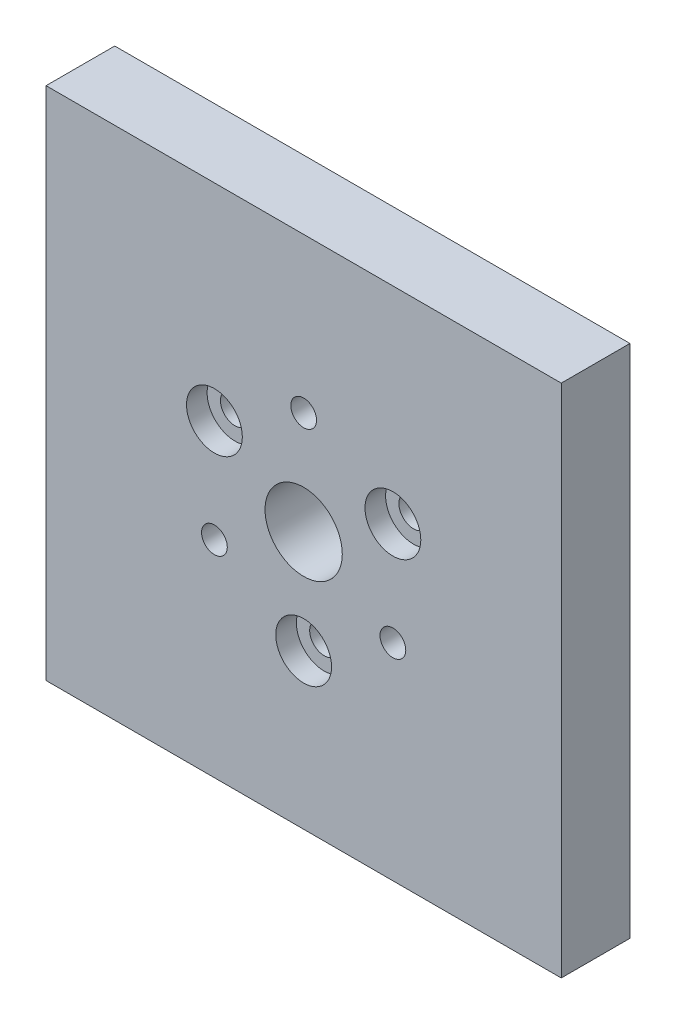
ISO-10303-21;
HEADER;
FILE_DESCRIPTION(('STEP AP214'),'2;1');
FILE_NAME('part.step','',(''),(''),'','','');
FILE_SCHEMA(('AUTOMOTIVE_DESIGN { 1 0 10303 214 1 1 1 1 }'));
ENDSEC;
DATA;
#1=APPLICATION_CONTEXT('core data for automotive mechanical design processes');
#2=APPLICATION_PROTOCOL_DEFINITION('international standard','automotive_design',2000,#1);
#3=PRODUCT_CONTEXT('',#1,'mechanical');
#4=PRODUCT('Part','Part','',(#3));
#5=PRODUCT_RELATED_PRODUCT_CATEGORY('part','',(#4));
#6=PRODUCT_DEFINITION_FORMATION('','',#4);
#7=PRODUCT_DEFINITION_CONTEXT('part definition',#1,'design');
#8=PRODUCT_DEFINITION('design','',#6,#7);
#9=PRODUCT_DEFINITION_SHAPE('','',#8);
#10=(LENGTH_UNIT() NAMED_UNIT(*) SI_UNIT(.MILLI.,.METRE.));
#11=(NAMED_UNIT(*) PLANE_ANGLE_UNIT() SI_UNIT($,.RADIAN.));
#12=(NAMED_UNIT(*) SI_UNIT($,.STERADIAN.) SOLID_ANGLE_UNIT());
#13=UNCERTAINTY_MEASURE_WITH_UNIT(LENGTH_MEASURE(1.E-05),#10,'distance_accuracy_value','');
#14=(GEOMETRIC_REPRESENTATION_CONTEXT(3) GLOBAL_UNCERTAINTY_ASSIGNED_CONTEXT((#13)) GLOBAL_UNIT_ASSIGNED_CONTEXT((#10,
#11,#12)) REPRESENTATION_CONTEXT('',''));
#15=CARTESIAN_POINT('',(0.,0.,0.));
#16=DIRECTION('',(0.,0.,1.));
#17=DIRECTION('',(1.,0.,0.));
#18=AXIS2_PLACEMENT_3D('',#15,#16,#17);
#19=CARTESIAN_POINT('',(0.,0.,8.));
#20=DIRECTION('',(1.,0.,0.));
#21=DIRECTION('',(0.,0.,-1.));
#22=AXIS2_PLACEMENT_3D('',#19,#20,#21);
#23=PLANE('',#22);
#24=DIRECTION('',(0.,-1.,0.));
#25=VECTOR('',#24,1.);
#26=CARTESIAN_POINT('',(0.,0.,0.));
#27=LINE('',#26,#25);
#28=CARTESIAN_POINT('',(0.,60.,0.));
#29=VERTEX_POINT('',#28);
#30=CARTESIAN_POINT('',(0.,0.,0.));
#31=VERTEX_POINT('',#30);
#32=EDGE_CURVE('E113',#29,#31,#27,.T.);
#33=ORIENTED_EDGE('',*,*,#32,.T.);
#34=DIRECTION('',(0.,0.,-1.));
#35=VECTOR('',#34,1.);
#36=CARTESIAN_POINT('',(0.,0.,8.));
#37=LINE('',#36,#35);
#38=CARTESIAN_POINT('',(0.,0.,8.));
#39=VERTEX_POINT('',#38);
#40=EDGE_CURVE('E11',#39,#31,#37,.T.);
#41=ORIENTED_EDGE('',*,*,#40,.F.);
#42=DIRECTION('',(0.,-1.,0.));
#43=VECTOR('',#42,1.);
#44=CARTESIAN_POINT('',(0.,0.,8.));
#45=LINE('',#44,#43);
#46=CARTESIAN_POINT('',(0.,60.,8.));
#47=VERTEX_POINT('',#46);
#48=EDGE_CURVE('E97',#47,#39,#45,.T.);
#49=ORIENTED_EDGE('',*,*,#48,.F.);
#50=DIRECTION('',(0.,0.,-1.));
#51=VECTOR('',#50,1.);
#52=CARTESIAN_POINT('',(0.,60.,8.));
#53=LINE('',#52,#51);
#54=EDGE_CURVE('E109',#47,#29,#53,.T.);
#55=ORIENTED_EDGE('',*,*,#54,.T.);
#56=EDGE_LOOP('',(#33,#41,#49,#55));
#57=FACE_BOUND('',#56,.T.);
#58=ADVANCED_FACE('F45',(#57),#23,.F.);
#59=CARTESIAN_POINT('',(0.,0.,8.));
#60=DIRECTION('',(0.,1.,0.));
#61=DIRECTION('',(0.,0.,1.));
#62=AXIS2_PLACEMENT_3D('',#59,#60,#61);
#63=PLANE('',#62);
#64=DIRECTION('',(1.,0.,0.));
#65=VECTOR('',#64,1.);
#66=CARTESIAN_POINT('',(0.,0.,0.));
#67=LINE('',#66,#65);
#68=CARTESIAN_POINT('',(60.,0.,0.));
#69=VERTEX_POINT('',#68);
#70=EDGE_CURVE('E102',#31,#69,#67,.T.);
#71=ORIENTED_EDGE('',*,*,#70,.T.);
#72=DIRECTION('',(0.,0.,-1.));
#73=VECTOR('',#72,1.);
#74=CARTESIAN_POINT('',(60.,0.,8.));
#75=LINE('',#74,#73);
#76=CARTESIAN_POINT('',(60.,0.,8.));
#77=VERTEX_POINT('',#76);
#78=EDGE_CURVE('E54',#77,#69,#75,.T.);
#79=ORIENTED_EDGE('',*,*,#78,.F.);
#80=DIRECTION('',(1.,0.,0.));
#81=VECTOR('',#80,1.);
#82=CARTESIAN_POINT('',(0.,0.,8.));
#83=LINE('',#82,#81);
#84=EDGE_CURVE('E92',#39,#77,#83,.T.);
#85=ORIENTED_EDGE('',*,*,#84,.F.);
#86=ORIENTED_EDGE('',*,*,#40,.T.);
#87=EDGE_LOOP('',(#71,#79,#85,#86));
#88=FACE_BOUND('',#87,.T.);
#89=ADVANCED_FACE('F101',(#88),#63,.F.);
#90=CARTESIAN_POINT('',(60.,0.,8.));
#91=DIRECTION('',(-1.,0.,0.));
#92=DIRECTION('',(0.,0.,1.));
#93=AXIS2_PLACEMENT_3D('',#90,#91,#92);
#94=PLANE('',#93);
#95=DIRECTION('',(0.,1.,0.));
#96=VECTOR('',#95,1.);
#97=CARTESIAN_POINT('',(60.,0.,0.));
#98=LINE('',#97,#96);
#99=CARTESIAN_POINT('',(60.,60.,0.));
#100=VERTEX_POINT('',#99);
#101=EDGE_CURVE('E79',#69,#100,#98,.T.);
#102=ORIENTED_EDGE('',*,*,#101,.T.);
#103=DIRECTION('',(0.,0.,-1.));
#104=VECTOR('',#103,1.);
#105=CARTESIAN_POINT('',(60.,60.,8.));
#106=LINE('',#105,#104);
#107=CARTESIAN_POINT('',(60.,60.,8.));
#108=VERTEX_POINT('',#107);
#109=EDGE_CURVE('E104',#108,#100,#106,.T.);
#110=ORIENTED_EDGE('',*,*,#109,.F.);
#111=DIRECTION('',(0.,1.,0.));
#112=VECTOR('',#111,1.);
#113=CARTESIAN_POINT('',(60.,0.,8.));
#114=LINE('',#113,#112);
#115=EDGE_CURVE('E95',#77,#108,#114,.T.);
#116=ORIENTED_EDGE('',*,*,#115,.F.);
#117=ORIENTED_EDGE('',*,*,#78,.T.);
#118=EDGE_LOOP('',(#102,#110,#116,#117));
#119=FACE_BOUND('',#118,.T.);
#120=ADVANCED_FACE('F105',(#119),#94,.F.);
#121=CARTESIAN_POINT('',(0.,60.,8.));
#122=DIRECTION('',(0.,-1.,0.));
#123=DIRECTION('',(0.,0.,-1.));
#124=AXIS2_PLACEMENT_3D('',#121,#122,#123);
#125=PLANE('',#124);
#126=DIRECTION('',(-1.,0.,0.));
#127=VECTOR('',#126,1.);
#128=CARTESIAN_POINT('',(0.,60.,0.));
#129=LINE('',#128,#127);
#130=EDGE_CURVE('E85',#100,#29,#129,.T.);
#131=ORIENTED_EDGE('',*,*,#130,.T.);
#132=ORIENTED_EDGE('',*,*,#54,.F.);
#133=DIRECTION('',(-1.,0.,0.));
#134=VECTOR('',#133,1.);
#135=CARTESIAN_POINT('',(0.,60.,8.));
#136=LINE('',#135,#134);
#137=EDGE_CURVE('E62',#108,#47,#136,.T.);
#138=ORIENTED_EDGE('',*,*,#137,.F.);
#139=ORIENTED_EDGE('',*,*,#109,.T.);
#140=EDGE_LOOP('',(#131,#132,#138,#139));
#141=FACE_BOUND('',#140,.T.);
#142=ADVANCED_FACE('F127',(#141),#125,.F.);
#143=CARTESIAN_POINT('',(0.,0.,8.));
#144=DIRECTION('',(0.,0.,-1.));
#145=DIRECTION('',(-1.,0.,0.));
#146=AXIS2_PLACEMENT_3D('',#143,#144,#145);
#147=PLANE('',#146);
#148=CARTESIAN_POINT('',(30.,18.,8.));
#149=DIRECTION('',(0.,0.,1.));
#150=DIRECTION('',(1.,0.,0.));
#151=AXIS2_PLACEMENT_3D('',#148,#149,#150);
#152=CIRCLE('',#151,3.25);
#153=CARTESIAN_POINT('',(33.25,18.,8.));
#154=VERTEX_POINT('',#153);
#155=EDGE_CURVE('E209',#154,#154,#152,.T.);
#156=ORIENTED_EDGE('',*,*,#155,.F.);
#157=EDGE_LOOP('',(#156));
#158=FACE_BOUND('',#157,.T.);
#159=CARTESIAN_POINT('',(19.6076951545868,36.,8.));
#160=DIRECTION('',(0.,0.,1.));
#161=DIRECTION('',(1.,0.,0.));
#162=AXIS2_PLACEMENT_3D('',#159,#160,#161);
#163=CIRCLE('',#162,3.25);
#164=CARTESIAN_POINT('',(22.8576951545868,36.,8.));
#165=VERTEX_POINT('',#164);
#166=EDGE_CURVE('E193',#165,#165,#163,.T.);
#167=ORIENTED_EDGE('',*,*,#166,.F.);
#168=EDGE_LOOP('',(#167));
#169=FACE_BOUND('',#168,.T.);
#170=CARTESIAN_POINT('',(40.3923048454133,35.9999999999999,8.));
#171=DIRECTION('',(0.,0.,1.));
#172=DIRECTION('',(1.,0.,0.));
#173=AXIS2_PLACEMENT_3D('',#170,#171,#172);
#174=CIRCLE('',#173,3.25);
#175=CARTESIAN_POINT('',(43.6423048454133,35.9999999999999,8.));
#176=VERTEX_POINT('',#175);
#177=EDGE_CURVE('E177',#176,#176,#174,.T.);
#178=ORIENTED_EDGE('',*,*,#177,.F.);
#179=EDGE_LOOP('',(#178));
#180=FACE_BOUND('',#179,.T.);
#181=CARTESIAN_POINT('',(30.,42.,8.));
#182=DIRECTION('',(0.,0.,1.));
#183=DIRECTION('',(1.,0.,0.));
#184=AXIS2_PLACEMENT_3D('',#181,#182,#183);
#185=CIRCLE('',#184,1.5);
#186=CARTESIAN_POINT('',(31.5,42.,8.));
#187=VERTEX_POINT('',#186);
#188=EDGE_CURVE('E161',#187,#187,#185,.T.);
#189=ORIENTED_EDGE('',*,*,#188,.F.);
#190=EDGE_LOOP('',(#189));
#191=FACE_BOUND('',#190,.T.);
#192=CARTESIAN_POINT('',(40.3923048454137,24.0000000000003,8.));
#193=DIRECTION('',(0.,0.,1.));
#194=DIRECTION('',(1.,0.,0.));
#195=AXIS2_PLACEMENT_3D('',#192,#193,#194);
#196=CIRCLE('',#195,1.5);
#197=CARTESIAN_POINT('',(41.8923048454137,24.0000000000003,8.));
#198=VERTEX_POINT('',#197);
#199=EDGE_CURVE('E153',#198,#198,#196,.T.);
#200=ORIENTED_EDGE('',*,*,#199,.F.);
#201=EDGE_LOOP('',(#200));
#202=FACE_BOUND('',#201,.T.);
#203=CARTESIAN_POINT('',(19.6076951545872,23.9999999999997,8.));
#204=DIRECTION('',(0.,0.,1.));
#205=DIRECTION('',(1.,0.,0.));
#206=AXIS2_PLACEMENT_3D('',#203,#204,#205);
#207=CIRCLE('',#206,1.5);
#208=CARTESIAN_POINT('',(21.1076951545872,23.9999999999997,8.));
#209=VERTEX_POINT('',#208);
#210=EDGE_CURVE('E145',#209,#209,#207,.T.);
#211=ORIENTED_EDGE('',*,*,#210,.F.);
#212=EDGE_LOOP('',(#211));
#213=FACE_BOUND('',#212,.T.);
#214=CARTESIAN_POINT('',(30.,30.,8.));
#215=DIRECTION('',(0.,0.,1.));
#216=DIRECTION('',(1.,0.,0.));
#217=AXIS2_PLACEMENT_3D('',#214,#215,#216);
#218=CIRCLE('',#217,4.5);
#219=CARTESIAN_POINT('',(34.5,30.,8.));
#220=VERTEX_POINT('',#219);
#221=EDGE_CURVE('E137',#220,#220,#218,.T.);
#222=ORIENTED_EDGE('',*,*,#221,.F.);
#223=EDGE_LOOP('',(#222));
#224=FACE_BOUND('',#223,.T.);
#225=ORIENTED_EDGE('',*,*,#48,.T.);
#226=ORIENTED_EDGE('',*,*,#84,.T.);
#227=ORIENTED_EDGE('',*,*,#115,.T.);
#228=ORIENTED_EDGE('',*,*,#137,.T.);
#229=EDGE_LOOP('',(#225,#226,#227,#228));
#230=FACE_BOUND('',#229,.T.);
#231=ADVANCED_FACE('F93',(#158,#169,#180,#191,#202,#213,#224,#230),#147,.F.);
#232=CARTESIAN_POINT('',(0.,0.,0.));
#233=DIRECTION('',(0.,0.,-1.));
#234=DIRECTION('',(-1.,0.,0.));
#235=AXIS2_PLACEMENT_3D('',#232,#233,#234);
#236=PLANE('',#235);
#237=CARTESIAN_POINT('',(30.,18.,0.));
#238=DIRECTION('',(0.,0.,1.));
#239=DIRECTION('',(1.,0.,0.));
#240=AXIS2_PLACEMENT_3D('',#237,#238,#239);
#241=CIRCLE('',#240,1.7);
#242=CARTESIAN_POINT('',(31.7,18.,0.));
#243=VERTEX_POINT('',#242);
#244=EDGE_CURVE('E197',#243,#243,#241,.T.);
#245=ORIENTED_EDGE('',*,*,#244,.T.);
#246=EDGE_LOOP('',(#245));
#247=FACE_BOUND('',#246,.T.);
#248=CARTESIAN_POINT('',(19.6076951545868,36.,0.));
#249=DIRECTION('',(0.,0.,1.));
#250=DIRECTION('',(1.,0.,0.));
#251=AXIS2_PLACEMENT_3D('',#248,#249,#250);
#252=CIRCLE('',#251,1.7);
#253=CARTESIAN_POINT('',(21.3076951545868,36.,0.));
#254=VERTEX_POINT('',#253);
#255=EDGE_CURVE('E181',#254,#254,#252,.T.);
#256=ORIENTED_EDGE('',*,*,#255,.T.);
#257=EDGE_LOOP('',(#256));
#258=FACE_BOUND('',#257,.T.);
#259=CARTESIAN_POINT('',(40.3923048454133,35.9999999999999,0.));
#260=DIRECTION('',(0.,0.,1.));
#261=DIRECTION('',(1.,0.,0.));
#262=AXIS2_PLACEMENT_3D('',#259,#260,#261);
#263=CIRCLE('',#262,1.7);
#264=CARTESIAN_POINT('',(42.0923048454133,35.9999999999999,0.));
#265=VERTEX_POINT('',#264);
#266=EDGE_CURVE('E165',#265,#265,#263,.T.);
#267=ORIENTED_EDGE('',*,*,#266,.T.);
#268=EDGE_LOOP('',(#267));
#269=FACE_BOUND('',#268,.T.);
#270=CARTESIAN_POINT('',(30.,42.,0.));
#271=DIRECTION('',(0.,0.,1.));
#272=DIRECTION('',(1.,0.,0.));
#273=AXIS2_PLACEMENT_3D('',#270,#271,#272);
#274=CIRCLE('',#273,1.5);
#275=CARTESIAN_POINT('',(31.5,42.,0.));
#276=VERTEX_POINT('',#275);
#277=EDGE_CURVE('E157',#276,#276,#274,.T.);
#278=ORIENTED_EDGE('',*,*,#277,.T.);
#279=EDGE_LOOP('',(#278));
#280=FACE_BOUND('',#279,.T.);
#281=CARTESIAN_POINT('',(40.3923048454137,24.0000000000003,0.));
#282=DIRECTION('',(0.,0.,1.));
#283=DIRECTION('',(1.,0.,0.));
#284=AXIS2_PLACEMENT_3D('',#281,#282,#283);
#285=CIRCLE('',#284,1.49999999999999);
#286=CARTESIAN_POINT('',(41.8923048454137,24.0000000000003,0.));
#287=VERTEX_POINT('',#286);
#288=EDGE_CURVE('E149',#287,#287,#285,.T.);
#289=ORIENTED_EDGE('',*,*,#288,.T.);
#290=EDGE_LOOP('',(#289));
#291=FACE_BOUND('',#290,.T.);
#292=CARTESIAN_POINT('',(19.6076951545872,23.9999999999997,0.));
#293=DIRECTION('',(0.,0.,1.));
#294=DIRECTION('',(1.,0.,0.));
#295=AXIS2_PLACEMENT_3D('',#292,#293,#294);
#296=CIRCLE('',#295,1.5);
#297=CARTESIAN_POINT('',(21.1076951545872,23.9999999999997,0.));
#298=VERTEX_POINT('',#297);
#299=EDGE_CURVE('E141',#298,#298,#296,.T.);
#300=ORIENTED_EDGE('',*,*,#299,.T.);
#301=EDGE_LOOP('',(#300));
#302=FACE_BOUND('',#301,.T.);
#303=CARTESIAN_POINT('',(30.,30.,0.));
#304=DIRECTION('',(0.,0.,1.));
#305=DIRECTION('',(1.,0.,0.));
#306=AXIS2_PLACEMENT_3D('',#303,#304,#305);
#307=CIRCLE('',#306,4.5);
#308=CARTESIAN_POINT('',(34.5,30.,0.));
#309=VERTEX_POINT('',#308);
#310=EDGE_CURVE('E117',#309,#309,#307,.T.);
#311=ORIENTED_EDGE('',*,*,#310,.T.);
#312=EDGE_LOOP('',(#311));
#313=FACE_BOUND('',#312,.T.);
#314=ORIENTED_EDGE('',*,*,#32,.F.);
#315=ORIENTED_EDGE('',*,*,#130,.F.);
#316=ORIENTED_EDGE('',*,*,#101,.F.);
#317=ORIENTED_EDGE('',*,*,#70,.F.);
#318=EDGE_LOOP('',(#314,#315,#316,#317));
#319=FACE_BOUND('',#318,.T.);
#320=ADVANCED_FACE('F130',(#247,#258,#269,#280,#291,#302,#313,#319),#236,.T.);
#321=CARTESIAN_POINT('',(30.,30.,8.));
#322=DIRECTION('',(0.,0.,1.));
#323=DIRECTION('',(1.,0.,0.));
#324=AXIS2_PLACEMENT_3D('',#321,#322,#323);
#325=CYLINDRICAL_SURFACE('',#324,4.5);
#326=ORIENTED_EDGE('',*,*,#310,.F.);
#327=EDGE_LOOP('',(#326));
#328=FACE_BOUND('',#327,.T.);
#329=ORIENTED_EDGE('',*,*,#221,.T.);
#330=EDGE_LOOP('',(#329));
#331=FACE_BOUND('',#330,.T.);
#332=ADVANCED_FACE('F231',(#328,#331),#325,.F.);
#333=CARTESIAN_POINT('',(19.6076951545872,23.9999999999997,8.));
#334=DIRECTION('',(0.,0.,1.));
#335=DIRECTION('',(1.,0.,0.));
#336=AXIS2_PLACEMENT_3D('',#333,#334,#335);
#337=CYLINDRICAL_SURFACE('',#336,1.5);
#338=ORIENTED_EDGE('',*,*,#299,.F.);
#339=EDGE_LOOP('',(#338));
#340=FACE_BOUND('',#339,.T.);
#341=ORIENTED_EDGE('',*,*,#210,.T.);
#342=EDGE_LOOP('',(#341));
#343=FACE_BOUND('',#342,.T.);
#344=ADVANCED_FACE('F233',(#340,#343),#337,.F.);
#345=CARTESIAN_POINT('',(40.3923048454137,24.0000000000003,8.));
#346=DIRECTION('',(0.,0.,1.));
#347=DIRECTION('',(1.,0.,0.));
#348=AXIS2_PLACEMENT_3D('',#345,#346,#347);
#349=CYLINDRICAL_SURFACE('',#348,1.5);
#350=ORIENTED_EDGE('',*,*,#288,.F.);
#351=EDGE_LOOP('',(#350));
#352=FACE_BOUND('',#351,.T.);
#353=ORIENTED_EDGE('',*,*,#199,.T.);
#354=EDGE_LOOP('',(#353));
#355=FACE_BOUND('',#354,.T.);
#356=ADVANCED_FACE('F240',(#352,#355),#349,.F.);
#357=CARTESIAN_POINT('',(30.,42.,8.));
#358=DIRECTION('',(0.,0.,1.));
#359=DIRECTION('',(1.,0.,0.));
#360=AXIS2_PLACEMENT_3D('',#357,#358,#359);
#361=CYLINDRICAL_SURFACE('',#360,1.5);
#362=ORIENTED_EDGE('',*,*,#277,.F.);
#363=EDGE_LOOP('',(#362));
#364=FACE_BOUND('',#363,.T.);
#365=ORIENTED_EDGE('',*,*,#188,.T.);
#366=EDGE_LOOP('',(#365));
#367=FACE_BOUND('',#366,.T.);
#368=ADVANCED_FACE('F300',(#364,#367),#361,.F.);
#369=CARTESIAN_POINT('',(40.3923048454133,35.9999999999999,8.));
#370=DIRECTION('',(0.,0.,1.));
#371=DIRECTION('',(1.,0.,0.));
#372=AXIS2_PLACEMENT_3D('',#369,#370,#371);
#373=CYLINDRICAL_SURFACE('',#372,1.7);
#374=ORIENTED_EDGE('',*,*,#266,.F.);
#375=EDGE_LOOP('',(#374));
#376=FACE_BOUND('',#375,.T.);
#377=CARTESIAN_POINT('',(40.3923048454133,35.9999999999999,5.6));
#378=DIRECTION('',(0.,0.,1.));
#379=DIRECTION('',(1.,0.,0.));
#380=AXIS2_PLACEMENT_3D('',#377,#378,#379);
#381=CIRCLE('',#380,1.7);
#382=CARTESIAN_POINT('',(42.0923048454133,35.9999999999999,5.6));
#383=VERTEX_POINT('',#382);
#384=EDGE_CURVE('E169',#383,#383,#381,.T.);
#385=ORIENTED_EDGE('',*,*,#384,.T.);
#386=EDGE_LOOP('',(#385));
#387=FACE_BOUND('',#386,.T.);
#388=ADVANCED_FACE('F309',(#376,#387),#373,.F.);
#389=CARTESIAN_POINT('',(42.0923048454133,35.9999999999999,5.6));
#390=DIRECTION('',(0.,0.,-1.));
#391=DIRECTION('',(-1.,0.,0.));
#392=AXIS2_PLACEMENT_3D('',#389,#390,#391);
#393=PLANE('',#392);
#394=ORIENTED_EDGE('',*,*,#384,.F.);
#395=EDGE_LOOP('',(#394));
#396=FACE_BOUND('',#395,.T.);
#397=CARTESIAN_POINT('',(40.3923048454133,35.9999999999999,5.6));
#398=DIRECTION('',(0.,0.,1.));
#399=DIRECTION('',(1.,0.,0.));
#400=AXIS2_PLACEMENT_3D('',#397,#398,#399);
#401=CIRCLE('',#400,3.25);
#402=CARTESIAN_POINT('',(43.6423048454133,35.9999999999999,5.6));
#403=VERTEX_POINT('',#402);
#404=EDGE_CURVE('E173',#403,#403,#401,.T.);
#405=ORIENTED_EDGE('',*,*,#404,.T.);
#406=EDGE_LOOP('',(#405));
#407=FACE_BOUND('',#406,.T.);
#408=ADVANCED_FACE('F318',(#396,#407),#393,.F.);
#409=CARTESIAN_POINT('',(40.3923048454133,35.9999999999999,8.));
#410=DIRECTION('',(0.,0.,1.));
#411=DIRECTION('',(1.,0.,0.));
#412=AXIS2_PLACEMENT_3D('',#409,#410,#411);
#413=CYLINDRICAL_SURFACE('',#412,3.25);
#414=ORIENTED_EDGE('',*,*,#404,.F.);
#415=EDGE_LOOP('',(#414));
#416=FACE_BOUND('',#415,.T.);
#417=ORIENTED_EDGE('',*,*,#177,.T.);
#418=EDGE_LOOP('',(#417));
#419=FACE_BOUND('',#418,.T.);
#420=ADVANCED_FACE('F327',(#416,#419),#413,.F.);
#421=CARTESIAN_POINT('',(19.6076951545868,36.,8.));
#422=DIRECTION('',(0.,0.,1.));
#423=DIRECTION('',(1.,0.,0.));
#424=AXIS2_PLACEMENT_3D('',#421,#422,#423);
#425=CYLINDRICAL_SURFACE('',#424,1.7);
#426=ORIENTED_EDGE('',*,*,#255,.F.);
#427=EDGE_LOOP('',(#426));
#428=FACE_BOUND('',#427,.T.);
#429=CARTESIAN_POINT('',(19.6076951545868,36.,5.6));
#430=DIRECTION('',(0.,0.,1.));
#431=DIRECTION('',(1.,0.,0.));
#432=AXIS2_PLACEMENT_3D('',#429,#430,#431);
#433=CIRCLE('',#432,1.7);
#434=CARTESIAN_POINT('',(21.3076951545868,36.,5.6));
#435=VERTEX_POINT('',#434);
#436=EDGE_CURVE('E185',#435,#435,#433,.T.);
#437=ORIENTED_EDGE('',*,*,#436,.T.);
#438=EDGE_LOOP('',(#437));
#439=FACE_BOUND('',#438,.T.);
#440=ADVANCED_FACE('F336',(#428,#439),#425,.F.);
#441=CARTESIAN_POINT('',(21.3076951545868,36.,5.6));
#442=DIRECTION('',(0.,0.,-1.));
#443=DIRECTION('',(-1.,0.,0.));
#444=AXIS2_PLACEMENT_3D('',#441,#442,#443);
#445=PLANE('',#444);
#446=ORIENTED_EDGE('',*,*,#436,.F.);
#447=EDGE_LOOP('',(#446));
#448=FACE_BOUND('',#447,.T.);
#449=CARTESIAN_POINT('',(19.6076951545868,36.,5.6));
#450=DIRECTION('',(0.,0.,1.));
#451=DIRECTION('',(1.,0.,0.));
#452=AXIS2_PLACEMENT_3D('',#449,#450,#451);
#453=CIRCLE('',#452,3.25);
#454=CARTESIAN_POINT('',(22.8576951545868,36.,5.6));
#455=VERTEX_POINT('',#454);
#456=EDGE_CURVE('E189',#455,#455,#453,.T.);
#457=ORIENTED_EDGE('',*,*,#456,.T.);
#458=EDGE_LOOP('',(#457));
#459=FACE_BOUND('',#458,.T.);
#460=ADVANCED_FACE('F345',(#448,#459),#445,.F.);
#461=CARTESIAN_POINT('',(19.6076951545868,36.,8.));
#462=DIRECTION('',(0.,0.,1.));
#463=DIRECTION('',(1.,0.,0.));
#464=AXIS2_PLACEMENT_3D('',#461,#462,#463);
#465=CYLINDRICAL_SURFACE('',#464,3.25);
#466=ORIENTED_EDGE('',*,*,#456,.F.);
#467=EDGE_LOOP('',(#466));
#468=FACE_BOUND('',#467,.T.);
#469=ORIENTED_EDGE('',*,*,#166,.T.);
#470=EDGE_LOOP('',(#469));
#471=FACE_BOUND('',#470,.T.);
#472=ADVANCED_FACE('F354',(#468,#471),#465,.F.);
#473=CARTESIAN_POINT('',(30.,18.,8.));
#474=DIRECTION('',(0.,0.,1.));
#475=DIRECTION('',(1.,0.,0.));
#476=AXIS2_PLACEMENT_3D('',#473,#474,#475);
#477=CYLINDRICAL_SURFACE('',#476,1.7);
#478=ORIENTED_EDGE('',*,*,#244,.F.);
#479=EDGE_LOOP('',(#478));
#480=FACE_BOUND('',#479,.T.);
#481=CARTESIAN_POINT('',(30.,18.,5.6));
#482=DIRECTION('',(0.,0.,1.));
#483=DIRECTION('',(1.,0.,0.));
#484=AXIS2_PLACEMENT_3D('',#481,#482,#483);
#485=CIRCLE('',#484,1.7);
#486=CARTESIAN_POINT('',(31.7,18.,5.6));
#487=VERTEX_POINT('',#486);
#488=EDGE_CURVE('E201',#487,#487,#485,.T.);
#489=ORIENTED_EDGE('',*,*,#488,.T.);
#490=EDGE_LOOP('',(#489));
#491=FACE_BOUND('',#490,.T.);
#492=ADVANCED_FACE('F363',(#480,#491),#477,.F.);
#493=CARTESIAN_POINT('',(31.7,18.,5.6));
#494=DIRECTION('',(0.,0.,-1.));
#495=DIRECTION('',(-1.,0.,0.));
#496=AXIS2_PLACEMENT_3D('',#493,#494,#495);
#497=PLANE('',#496);
#498=ORIENTED_EDGE('',*,*,#488,.F.);
#499=EDGE_LOOP('',(#498));
#500=FACE_BOUND('',#499,.T.);
#501=CARTESIAN_POINT('',(30.,18.,5.6));
#502=DIRECTION('',(0.,0.,1.));
#503=DIRECTION('',(1.,0.,0.));
#504=AXIS2_PLACEMENT_3D('',#501,#502,#503);
#505=CIRCLE('',#504,3.25);
#506=CARTESIAN_POINT('',(33.25,18.,5.6));
#507=VERTEX_POINT('',#506);
#508=EDGE_CURVE('E205',#507,#507,#505,.T.);
#509=ORIENTED_EDGE('',*,*,#508,.T.);
#510=EDGE_LOOP('',(#509));
#511=FACE_BOUND('',#510,.T.);
#512=ADVANCED_FACE('F372',(#500,#511),#497,.F.);
#513=CARTESIAN_POINT('',(30.,18.,8.));
#514=DIRECTION('',(0.,0.,1.));
#515=DIRECTION('',(1.,0.,0.));
#516=AXIS2_PLACEMENT_3D('',#513,#514,#515);
#517=CYLINDRICAL_SURFACE('',#516,3.25);
#518=ORIENTED_EDGE('',*,*,#508,.F.);
#519=EDGE_LOOP('',(#518));
#520=FACE_BOUND('',#519,.T.);
#521=ORIENTED_EDGE('',*,*,#155,.T.);
#522=EDGE_LOOP('',(#521));
#523=FACE_BOUND('',#522,.T.);
#524=ADVANCED_FACE('F214',(#520,#523),#517,.F.);
#525=CLOSED_SHELL('',(#58,#89,#120,#142,#231,#320,#332,#344,#356,#368,#388,#408,#420,#440,#460,
#472,#492,#512,#524));
#526=MANIFOLD_SOLID_BREP('B2',#525);
#527=ADVANCED_BREP_SHAPE_REPRESENTATION('',(#18,#526),#14);
#528=SHAPE_DEFINITION_REPRESENTATION(#9,#527);
ENDSEC;
END-ISO-10303-21;
